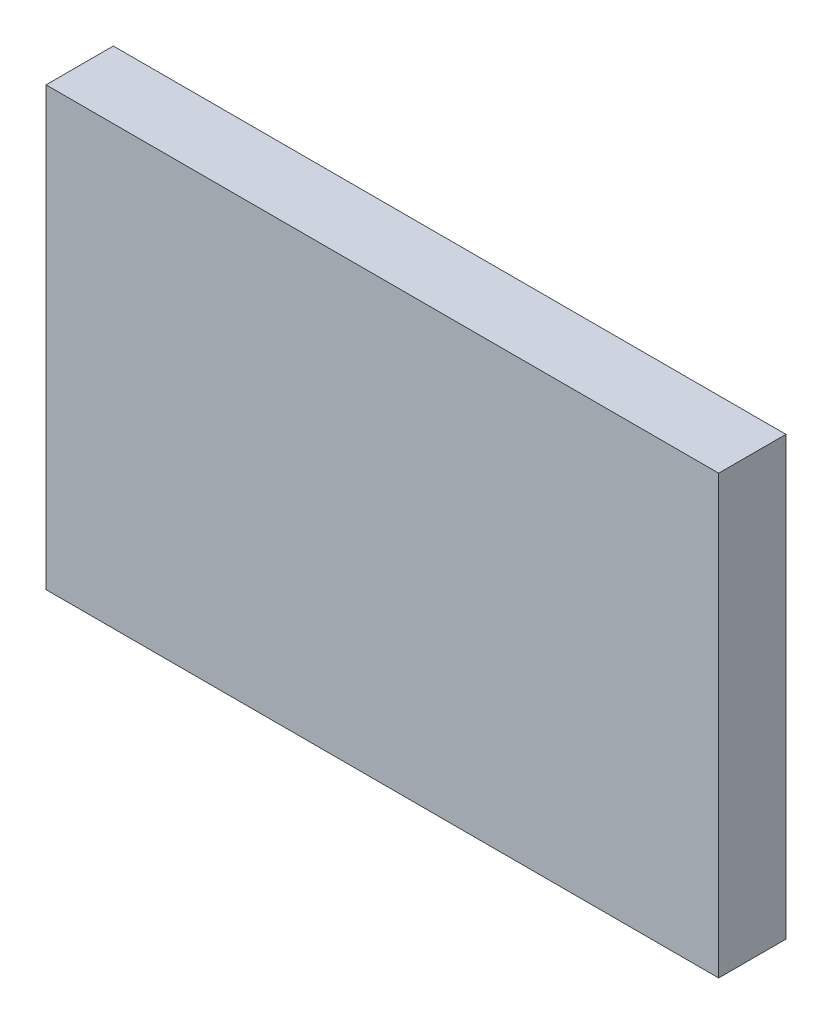
ISO-10303-21;
HEADER;
FILE_DESCRIPTION(('STEP AP214'),'2;1');
FILE_NAME('part.step','',(''),(''),'','','');
FILE_SCHEMA(('AUTOMOTIVE_DESIGN { 1 0 10303 214 1 1 1 1 }'));
ENDSEC;
DATA;
#1=APPLICATION_CONTEXT('core data for automotive mechanical design processes');
#2=APPLICATION_PROTOCOL_DEFINITION('international standard','automotive_design',2000,#1);
#3=PRODUCT_CONTEXT('',#1,'mechanical');
#4=PRODUCT('Part','Part','',(#3));
#5=PRODUCT_RELATED_PRODUCT_CATEGORY('part','',(#4));
#6=PRODUCT_DEFINITION_FORMATION('','',#4);
#7=PRODUCT_DEFINITION_CONTEXT('part definition',#1,'design');
#8=PRODUCT_DEFINITION('design','',#6,#7);
#9=PRODUCT_DEFINITION_SHAPE('','',#8);
#10=(LENGTH_UNIT() NAMED_UNIT(*) SI_UNIT(.MILLI.,.METRE.));
#11=(NAMED_UNIT(*) PLANE_ANGLE_UNIT() SI_UNIT($,.RADIAN.));
#12=(NAMED_UNIT(*) SI_UNIT($,.STERADIAN.) SOLID_ANGLE_UNIT());
#13=UNCERTAINTY_MEASURE_WITH_UNIT(LENGTH_MEASURE(1.E-05),#10,'distance_accuracy_value','');
#14=(GEOMETRIC_REPRESENTATION_CONTEXT(3) GLOBAL_UNCERTAINTY_ASSIGNED_CONTEXT((#13)) GLOBAL_UNIT_ASSIGNED_CONTEXT((#10,
#11,#12)) REPRESENTATION_CONTEXT('',''));
#15=CARTESIAN_POINT('',(0.,0.,0.));
#16=DIRECTION('',(0.,0.,1.));
#17=DIRECTION('',(1.,0.,0.));
#18=AXIS2_PLACEMENT_3D('',#15,#16,#17);
#19=CARTESIAN_POINT('',(0.,0.,2.));
#20=DIRECTION('',(0.,0.,1.));
#21=DIRECTION('',(1.,0.,0.));
#22=AXIS2_PLACEMENT_3D('',#19,#20,#21);
#23=PLANE('',#22);
#24=DIRECTION('',(1.,0.,0.));
#25=VECTOR('',#24,1.);
#26=CARTESIAN_POINT('',(0.,0.,2.));
#27=LINE('',#26,#25);
#28=CARTESIAN_POINT('',(0.,0.,2.));
#29=VERTEX_POINT('',#28);
#30=CARTESIAN_POINT('',(20.,0.,2.));
#31=VERTEX_POINT('',#30);
#32=EDGE_CURVE('E74',#29,#31,#27,.T.);
#33=ORIENTED_EDGE('',*,*,#32,.T.);
#34=DIRECTION('',(0.,1.,0.));
#35=VECTOR('',#34,1.);
#36=CARTESIAN_POINT('',(20.,13.,2.));
#37=LINE('',#36,#35);
#38=CARTESIAN_POINT('',(20.,13.,2.));
#39=VERTEX_POINT('',#38);
#40=EDGE_CURVE('E48',#31,#39,#37,.T.);
#41=ORIENTED_EDGE('',*,*,#40,.T.);
#42=DIRECTION('',(-1.,0.,0.));
#43=VECTOR('',#42,1.);
#44=CARTESIAN_POINT('',(0.,13.,2.));
#45=LINE('',#44,#43);
#46=CARTESIAN_POINT('',(0.,13.,2.));
#47=VERTEX_POINT('',#46);
#48=EDGE_CURVE('E82',#39,#47,#45,.T.);
#49=ORIENTED_EDGE('',*,*,#48,.T.);
#50=DIRECTION('',(0.,-1.,0.));
#51=VECTOR('',#50,1.);
#52=CARTESIAN_POINT('',(0.,13.,2.));
#53=LINE('',#52,#51);
#54=EDGE_CURVE('E80',#47,#29,#53,.T.);
#55=ORIENTED_EDGE('',*,*,#54,.T.);
#56=EDGE_LOOP('',(#33,#41,#49,#55));
#57=FACE_BOUND('',#56,.T.);
#58=ADVANCED_FACE('F33',(#57),#23,.T.);
#59=CARTESIAN_POINT('',(0.,0.,9.));
#60=DIRECTION('',(1.,0.,0.));
#61=DIRECTION('',(0.,1.,0.));
#62=AXIS2_PLACEMENT_3D('',#59,#60,#61);
#63=PLANE('',#62);
#64=ORIENTED_EDGE('',*,*,#54,.F.);
#65=DIRECTION('',(0.,0.,-1.));
#66=VECTOR('',#65,1.);
#67=CARTESIAN_POINT('',(0.,13.,9.));
#68=LINE('',#67,#66);
#69=CARTESIAN_POINT('',(0.,13.,0.));
#70=VERTEX_POINT('',#69);
#71=EDGE_CURVE('E56',#47,#70,#68,.T.);
#72=ORIENTED_EDGE('',*,*,#71,.T.);
#73=DIRECTION('',(0.,-1.,0.));
#74=VECTOR('',#73,1.);
#75=CARTESIAN_POINT('',(0.,0.,0.));
#76=LINE('',#75,#74);
#77=CARTESIAN_POINT('',(0.,0.,0.));
#78=VERTEX_POINT('',#77);
#79=EDGE_CURVE('E85',#70,#78,#76,.T.);
#80=ORIENTED_EDGE('',*,*,#79,.T.);
#81=DIRECTION('',(0.,0.,-1.));
#82=VECTOR('',#81,1.);
#83=CARTESIAN_POINT('',(0.,0.,9.));
#84=LINE('',#83,#82);
#85=EDGE_CURVE('E11',#29,#78,#84,.T.);
#86=ORIENTED_EDGE('',*,*,#85,.F.);
#87=EDGE_LOOP('',(#64,#72,#80,#86));
#88=FACE_BOUND('',#87,.T.);
#89=ADVANCED_FACE('F35',(#88),#63,.F.);
#90=CARTESIAN_POINT('',(0.,0.,9.));
#91=DIRECTION('',(0.,1.,0.));
#92=DIRECTION('',(0.,0.,1.));
#93=AXIS2_PLACEMENT_3D('',#90,#91,#92);
#94=PLANE('',#93);
#95=ORIENTED_EDGE('',*,*,#32,.F.);
#96=ORIENTED_EDGE('',*,*,#85,.T.);
#97=DIRECTION('',(1.,0.,0.));
#98=VECTOR('',#97,1.);
#99=CARTESIAN_POINT('',(0.,0.,0.));
#100=LINE('',#99,#98);
#101=CARTESIAN_POINT('',(20.,0.,0.));
#102=VERTEX_POINT('',#101);
#103=EDGE_CURVE('E88',#78,#102,#100,.T.);
#104=ORIENTED_EDGE('',*,*,#103,.T.);
#105=DIRECTION('',(0.,0.,-1.));
#106=VECTOR('',#105,1.);
#107=CARTESIAN_POINT('',(20.,0.,9.));
#108=LINE('',#107,#106);
#109=EDGE_CURVE('E41',#31,#102,#108,.T.);
#110=ORIENTED_EDGE('',*,*,#109,.F.);
#111=EDGE_LOOP('',(#95,#96,#104,#110));
#112=FACE_BOUND('',#111,.T.);
#113=ADVANCED_FACE('F76',(#112),#94,.F.);
#114=CARTESIAN_POINT('',(20.,0.,9.));
#115=DIRECTION('',(-1.,0.,0.));
#116=DIRECTION('',(0.,-1.,0.));
#117=AXIS2_PLACEMENT_3D('',#114,#115,#116);
#118=PLANE('',#117);
#119=ORIENTED_EDGE('',*,*,#40,.F.);
#120=ORIENTED_EDGE('',*,*,#109,.T.);
#121=DIRECTION('',(0.,1.,0.));
#122=VECTOR('',#121,1.);
#123=CARTESIAN_POINT('',(20.,0.,0.));
#124=LINE('',#123,#122);
#125=CARTESIAN_POINT('',(20.,13.,0.));
#126=VERTEX_POINT('',#125);
#127=EDGE_CURVE('E90',#102,#126,#124,.T.);
#128=ORIENTED_EDGE('',*,*,#127,.T.);
#129=DIRECTION('',(0.,0.,-1.));
#130=VECTOR('',#129,1.);
#131=CARTESIAN_POINT('',(20.,13.,9.));
#132=LINE('',#131,#130);
#133=EDGE_CURVE('E100',#39,#126,#132,.T.);
#134=ORIENTED_EDGE('',*,*,#133,.F.);
#135=EDGE_LOOP('',(#119,#120,#128,#134));
#136=FACE_BOUND('',#135,.T.);
#137=ADVANCED_FACE('F102',(#136),#118,.F.);
#138=CARTESIAN_POINT('',(0.,13.,9.));
#139=DIRECTION('',(0.,-1.,0.));
#140=DIRECTION('',(0.,0.,-1.));
#141=AXIS2_PLACEMENT_3D('',#138,#139,#140);
#142=PLANE('',#141);
#143=ORIENTED_EDGE('',*,*,#48,.F.);
#144=ORIENTED_EDGE('',*,*,#133,.T.);
#145=DIRECTION('',(-1.,0.,0.));
#146=VECTOR('',#145,1.);
#147=CARTESIAN_POINT('',(0.,13.,0.));
#148=LINE('',#147,#146);
#149=EDGE_CURVE('E97',#126,#70,#148,.T.);
#150=ORIENTED_EDGE('',*,*,#149,.T.);
#151=ORIENTED_EDGE('',*,*,#71,.F.);
#152=EDGE_LOOP('',(#143,#144,#150,#151));
#153=FACE_BOUND('',#152,.T.);
#154=ADVANCED_FACE('F107',(#153),#142,.F.);
#155=CARTESIAN_POINT('',(0.,0.,0.));
#156=DIRECTION('',(0.,0.,-1.));
#157=DIRECTION('',(-1.,0.,0.));
#158=AXIS2_PLACEMENT_3D('',#155,#156,#157);
#159=PLANE('',#158);
#160=ORIENTED_EDGE('',*,*,#79,.F.);
#161=ORIENTED_EDGE('',*,*,#149,.F.);
#162=ORIENTED_EDGE('',*,*,#127,.F.);
#163=ORIENTED_EDGE('',*,*,#103,.F.);
#164=EDGE_LOOP('',(#160,#161,#162,#163));
#165=FACE_BOUND('',#164,.T.);
#166=ADVANCED_FACE('F105',(#165),#159,.T.);
#167=CLOSED_SHELL('',(#58,#89,#113,#137,#154,#166));
#168=MANIFOLD_SOLID_BREP('B2',#167);
#169=ADVANCED_BREP_SHAPE_REPRESENTATION('',(#18,#168),#14);
#170=SHAPE_DEFINITION_REPRESENTATION(#9,#169);
ENDSEC;
END-ISO-10303-21;
